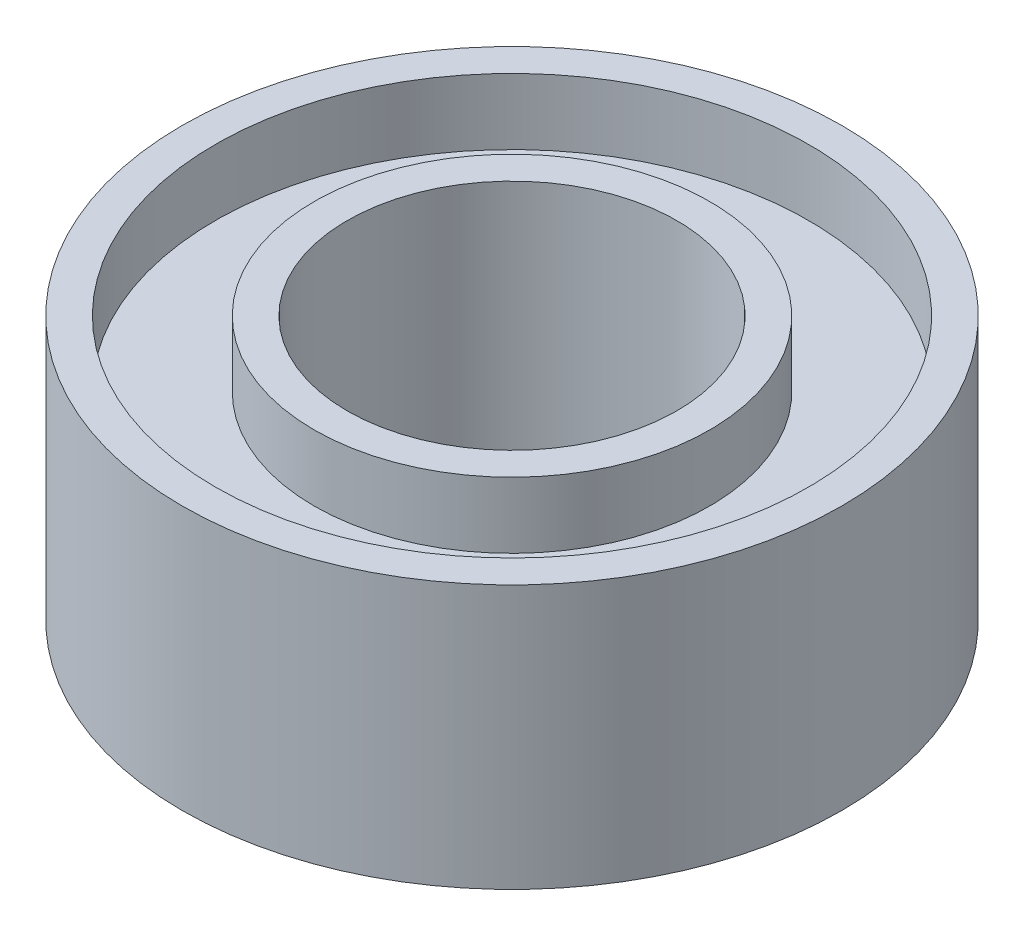
ISO-10303-21;
HEADER;
FILE_DESCRIPTION(('STEP AP214'),'2;1');
FILE_NAME('part.step','',(''),(''),'','','');
FILE_SCHEMA(('AUTOMOTIVE_DESIGN { 1 0 10303 214 1 1 1 1 }'));
ENDSEC;
DATA;
#1=APPLICATION_CONTEXT('core data for automotive mechanical design processes');
#2=APPLICATION_PROTOCOL_DEFINITION('international standard','automotive_design',2000,#1);
#3=PRODUCT_CONTEXT('',#1,'mechanical');
#4=PRODUCT('Part','Part','',(#3));
#5=PRODUCT_RELATED_PRODUCT_CATEGORY('part','',(#4));
#6=PRODUCT_DEFINITION_FORMATION('','',#4);
#7=PRODUCT_DEFINITION_CONTEXT('part definition',#1,'design');
#8=PRODUCT_DEFINITION('design','',#6,#7);
#9=PRODUCT_DEFINITION_SHAPE('','',#8);
#10=(LENGTH_UNIT() NAMED_UNIT(*) SI_UNIT(.MILLI.,.METRE.));
#11=(NAMED_UNIT(*) PLANE_ANGLE_UNIT() SI_UNIT($,.RADIAN.));
#12=(NAMED_UNIT(*) SI_UNIT($,.STERADIAN.) SOLID_ANGLE_UNIT());
#13=UNCERTAINTY_MEASURE_WITH_UNIT(LENGTH_MEASURE(1.E-05),#10,'distance_accuracy_value','');
#14=(GEOMETRIC_REPRESENTATION_CONTEXT(3) GLOBAL_UNCERTAINTY_ASSIGNED_CONTEXT((#13)) GLOBAL_UNIT_ASSIGNED_CONTEXT((#10,
#11,#12)) REPRESENTATION_CONTEXT('',''));
#15=CARTESIAN_POINT('',(0.,0.,0.));
#16=DIRECTION('',(0.,0.,1.));
#17=DIRECTION('',(1.,0.,0.));
#18=AXIS2_PLACEMENT_3D('',#15,#16,#17);
#19=CARTESIAN_POINT('',(0.,0.,0.));
#20=DIRECTION('',(0.,1.,0.));
#21=DIRECTION('',(0.,0.,1.));
#22=AXIS2_PLACEMENT_3D('',#19,#20,#21);
#23=PLANE('',#22);
#24=CARTESIAN_POINT('',(0.,0.,0.));
#25=DIRECTION('',(0.,1.,0.));
#26=DIRECTION('',(0.,0.,1.));
#27=AXIS2_PLACEMENT_3D('',#24,#25,#26);
#28=CIRCLE('',#27,2.5);
#29=CARTESIAN_POINT('',(0.,0.,2.5));
#30=VERTEX_POINT('',#29);
#31=EDGE_CURVE('E56',#30,#30,#28,.T.);
#32=ORIENTED_EDGE('',*,*,#31,.T.);
#33=EDGE_LOOP('',(#32));
#34=FACE_BOUND('',#33,.T.);
#35=CARTESIAN_POINT('',(0.,0.,0.));
#36=DIRECTION('',(0.,-1.,0.));
#37=DIRECTION('',(0.,0.,-1.));
#38=AXIS2_PLACEMENT_3D('',#35,#36,#37);
#39=CIRCLE('',#38,3.);
#40=CARTESIAN_POINT('',(0.,0.,-3.));
#41=VERTEX_POINT('',#40);
#42=EDGE_CURVE('E80',#41,#41,#39,.T.);
#43=ORIENTED_EDGE('',*,*,#42,.T.);
#44=EDGE_LOOP('',(#43));
#45=FACE_BOUND('',#44,.T.);
#46=ADVANCED_FACE('F43',(#34,#45),#23,.F.);
#47=CARTESIAN_POINT('',(0.,4.,0.));
#48=DIRECTION('',(0.,1.,0.));
#49=DIRECTION('',(0.,0.,1.));
#50=AXIS2_PLACEMENT_3D('',#47,#48,#49);
#51=PLANE('',#50);
#52=CARTESIAN_POINT('',(0.,4.,0.));
#53=DIRECTION('',(0.,1.,0.));
#54=DIRECTION('',(0.,0.,1.));
#55=AXIS2_PLACEMENT_3D('',#52,#53,#54);
#56=CIRCLE('',#55,2.5);
#57=CARTESIAN_POINT('',(0.,4.,2.5));
#58=VERTEX_POINT('',#57);
#59=EDGE_CURVE('E54',#58,#58,#56,.T.);
#60=ORIENTED_EDGE('',*,*,#59,.F.);
#61=EDGE_LOOP('',(#60));
#62=FACE_BOUND('',#61,.T.);
#63=CARTESIAN_POINT('',(0.,4.,0.));
#64=DIRECTION('',(0.,1.,0.));
#65=DIRECTION('',(0.,0.,1.));
#66=AXIS2_PLACEMENT_3D('',#63,#64,#65);
#67=CIRCLE('',#66,3.);
#68=CARTESIAN_POINT('',(0.,4.,3.));
#69=VERTEX_POINT('',#68);
#70=EDGE_CURVE('E68',#69,#69,#67,.T.);
#71=ORIENTED_EDGE('',*,*,#70,.T.);
#72=EDGE_LOOP('',(#71));
#73=FACE_BOUND('',#72,.T.);
#74=ADVANCED_FACE('F118',(#62,#73),#51,.T.);
#75=CARTESIAN_POINT('',(0.,4.,0.));
#76=DIRECTION('',(0.,1.,0.));
#77=DIRECTION('',(0.,0.,1.));
#78=AXIS2_PLACEMENT_3D('',#75,#76,#77);
#79=CIRCLE('',#78,4.5);
#80=CARTESIAN_POINT('',(0.,4.,4.5));
#81=VERTEX_POINT('',#80);
#82=EDGE_CURVE('E62',#81,#81,#79,.T.);
#83=ORIENTED_EDGE('',*,*,#82,.F.);
#84=EDGE_LOOP('',(#83));
#85=FACE_BOUND('',#84,.T.);
#86=CARTESIAN_POINT('',(0.,4.,0.));
#87=DIRECTION('',(0.,1.,0.));
#88=DIRECTION('',(0.,0.,1.));
#89=AXIS2_PLACEMENT_3D('',#86,#87,#88);
#90=CIRCLE('',#89,5.);
#91=CARTESIAN_POINT('',(0.,4.,5.));
#92=VERTEX_POINT('',#91);
#93=EDGE_CURVE('E11',#92,#92,#90,.T.);
#94=ORIENTED_EDGE('',*,*,#93,.T.);
#95=EDGE_LOOP('',(#94));
#96=FACE_BOUND('',#95,.T.);
#97=ADVANCED_FACE('F105',(#85,#96),#51,.T.);
#98=CARTESIAN_POINT('',(0.,0.,0.));
#99=DIRECTION('',(0.,-1.,0.));
#100=DIRECTION('',(0.,0.,-1.));
#101=AXIS2_PLACEMENT_3D('',#98,#99,#100);
#102=CIRCLE('',#101,4.5);
#103=CARTESIAN_POINT('',(0.,0.,-4.5));
#104=VERTEX_POINT('',#103);
#105=EDGE_CURVE('E74',#104,#104,#102,.T.);
#106=ORIENTED_EDGE('',*,*,#105,.F.);
#107=EDGE_LOOP('',(#106));
#108=FACE_BOUND('',#107,.T.);
#109=CARTESIAN_POINT('',(0.,0.,0.));
#110=DIRECTION('',(0.,1.,0.));
#111=DIRECTION('',(0.,0.,1.));
#112=AXIS2_PLACEMENT_3D('',#109,#110,#111);
#113=CIRCLE('',#112,5.);
#114=CARTESIAN_POINT('',(0.,0.,5.));
#115=VERTEX_POINT('',#114);
#116=EDGE_CURVE('E47',#115,#115,#113,.T.);
#117=ORIENTED_EDGE('',*,*,#116,.F.);
#118=EDGE_LOOP('',(#117));
#119=FACE_BOUND('',#118,.T.);
#120=ADVANCED_FACE('F102',(#108,#119),#23,.F.);
#121=CARTESIAN_POINT('',(0.,4.,0.));
#122=DIRECTION('',(0.,-1.,0.));
#123=DIRECTION('',(0.,0.,-1.));
#124=AXIS2_PLACEMENT_3D('',#121,#122,#123);
#125=CYLINDRICAL_SURFACE('',#124,5.);
#126=ORIENTED_EDGE('',*,*,#93,.F.);
#127=EDGE_LOOP('',(#126));
#128=FACE_BOUND('',#127,.T.);
#129=ORIENTED_EDGE('',*,*,#116,.T.);
#130=EDGE_LOOP('',(#129));
#131=FACE_BOUND('',#130,.T.);
#132=ADVANCED_FACE('F45',(#128,#131),#125,.T.);
#133=CARTESIAN_POINT('',(0.,4.,0.));
#134=DIRECTION('',(0.,-1.,0.));
#135=DIRECTION('',(0.,0.,-1.));
#136=AXIS2_PLACEMENT_3D('',#133,#134,#135);
#137=CYLINDRICAL_SURFACE('',#136,2.5);
#138=ORIENTED_EDGE('',*,*,#59,.T.);
#139=EDGE_LOOP('',(#138));
#140=FACE_BOUND('',#139,.T.);
#141=ORIENTED_EDGE('',*,*,#31,.F.);
#142=EDGE_LOOP('',(#141));
#143=FACE_BOUND('',#142,.T.);
#144=ADVANCED_FACE('F109',(#140,#143),#137,.F.);
#145=CARTESIAN_POINT('',(0.,3.,0.));
#146=DIRECTION('',(0.,1.,0.));
#147=DIRECTION('',(0.,0.,1.));
#148=AXIS2_PLACEMENT_3D('',#145,#146,#147);
#149=CYLINDRICAL_SURFACE('',#148,4.5);
#150=CARTESIAN_POINT('',(0.,3.,0.));
#151=DIRECTION('',(0.,1.,0.));
#152=DIRECTION('',(0.,0.,1.));
#153=AXIS2_PLACEMENT_3D('',#150,#151,#152);
#154=CIRCLE('',#153,4.5);
#155=CARTESIAN_POINT('',(0.,3.,4.5));
#156=VERTEX_POINT('',#155);
#157=EDGE_CURVE('E59',#156,#156,#154,.T.);
#158=ORIENTED_EDGE('',*,*,#157,.F.);
#159=EDGE_LOOP('',(#158));
#160=FACE_BOUND('',#159,.T.);
#161=ORIENTED_EDGE('',*,*,#82,.T.);
#162=EDGE_LOOP('',(#161));
#163=FACE_BOUND('',#162,.T.);
#164=ADVANCED_FACE('F114',(#160,#163),#149,.F.);
#165=CARTESIAN_POINT('',(0.,3.,0.));
#166=DIRECTION('',(0.,1.,0.));
#167=DIRECTION('',(0.,0.,1.));
#168=AXIS2_PLACEMENT_3D('',#165,#166,#167);
#169=PLANE('',#168);
#170=CARTESIAN_POINT('',(0.,3.,0.));
#171=DIRECTION('',(0.,1.,0.));
#172=DIRECTION('',(0.,0.,1.));
#173=AXIS2_PLACEMENT_3D('',#170,#171,#172);
#174=CIRCLE('',#173,3.);
#175=CARTESIAN_POINT('',(0.,3.,3.));
#176=VERTEX_POINT('',#175);
#177=EDGE_CURVE('E65',#176,#176,#174,.T.);
#178=ORIENTED_EDGE('',*,*,#177,.F.);
#179=EDGE_LOOP('',(#178));
#180=FACE_BOUND('',#179,.T.);
#181=ORIENTED_EDGE('',*,*,#157,.T.);
#182=EDGE_LOOP('',(#181));
#183=FACE_BOUND('',#182,.T.);
#184=ADVANCED_FACE('F131',(#180,#183),#169,.T.);
#185=CARTESIAN_POINT('',(0.,3.,0.));
#186=DIRECTION('',(0.,1.,0.));
#187=DIRECTION('',(0.,0.,1.));
#188=AXIS2_PLACEMENT_3D('',#185,#186,#187);
#189=CYLINDRICAL_SURFACE('',#188,3.);
#190=ORIENTED_EDGE('',*,*,#177,.T.);
#191=EDGE_LOOP('',(#190));
#192=FACE_BOUND('',#191,.T.);
#193=ORIENTED_EDGE('',*,*,#70,.F.);
#194=EDGE_LOOP('',(#193));
#195=FACE_BOUND('',#194,.T.);
#196=ADVANCED_FACE('F98',(#192,#195),#189,.T.);
#197=CARTESIAN_POINT('',(0.,1.,0.));
#198=DIRECTION('',(0.,-1.,0.));
#199=DIRECTION('',(0.,0.,-1.));
#200=AXIS2_PLACEMENT_3D('',#197,#198,#199);
#201=CYLINDRICAL_SURFACE('',#200,4.5);
#202=CARTESIAN_POINT('',(0.,1.,0.));
#203=DIRECTION('',(0.,-1.,0.));
#204=DIRECTION('',(0.,0.,-1.));
#205=AXIS2_PLACEMENT_3D('',#202,#203,#204);
#206=CIRCLE('',#205,4.5);
#207=CARTESIAN_POINT('',(0.,1.,-4.5));
#208=VERTEX_POINT('',#207);
#209=EDGE_CURVE('E71',#208,#208,#206,.T.);
#210=ORIENTED_EDGE('',*,*,#209,.F.);
#211=EDGE_LOOP('',(#210));
#212=FACE_BOUND('',#211,.T.);
#213=ORIENTED_EDGE('',*,*,#105,.T.);
#214=EDGE_LOOP('',(#213));
#215=FACE_BOUND('',#214,.T.);
#216=ADVANCED_FACE('F92',(#212,#215),#201,.F.);
#217=CARTESIAN_POINT('',(0.,1.,0.));
#218=DIRECTION('',(0.,-1.,0.));
#219=DIRECTION('',(0.,0.,-1.));
#220=AXIS2_PLACEMENT_3D('',#217,#218,#219);
#221=PLANE('',#220);
#222=CARTESIAN_POINT('',(0.,1.,0.));
#223=DIRECTION('',(0.,-1.,0.));
#224=DIRECTION('',(0.,0.,-1.));
#225=AXIS2_PLACEMENT_3D('',#222,#223,#224);
#226=CIRCLE('',#225,3.);
#227=CARTESIAN_POINT('',(0.,1.,-3.));
#228=VERTEX_POINT('',#227);
#229=EDGE_CURVE('E77',#228,#228,#226,.T.);
#230=ORIENTED_EDGE('',*,*,#229,.F.);
#231=EDGE_LOOP('',(#230));
#232=FACE_BOUND('',#231,.T.);
#233=ORIENTED_EDGE('',*,*,#209,.T.);
#234=EDGE_LOOP('',(#233));
#235=FACE_BOUND('',#234,.T.);
#236=ADVANCED_FACE('F89',(#232,#235),#221,.T.);
#237=CARTESIAN_POINT('',(0.,1.,0.));
#238=DIRECTION('',(0.,-1.,0.));
#239=DIRECTION('',(0.,0.,-1.));
#240=AXIS2_PLACEMENT_3D('',#237,#238,#239);
#241=CYLINDRICAL_SURFACE('',#240,3.);
#242=ORIENTED_EDGE('',*,*,#229,.T.);
#243=EDGE_LOOP('',(#242));
#244=FACE_BOUND('',#243,.T.);
#245=ORIENTED_EDGE('',*,*,#42,.F.);
#246=EDGE_LOOP('',(#245));
#247=FACE_BOUND('',#246,.T.);
#248=ADVANCED_FACE('F86',(#244,#247),#241,.T.);
#249=CLOSED_SHELL('',(#46,#74,#97,#120,#132,#144,#164,#184,#196,#216,#236,#248));
#250=MANIFOLD_SOLID_BREP('B2',#249);
#251=ADVANCED_BREP_SHAPE_REPRESENTATION('',(#18,#250),#14);
#252=SHAPE_DEFINITION_REPRESENTATION(#9,#251);
ENDSEC;
END-ISO-10303-21;
